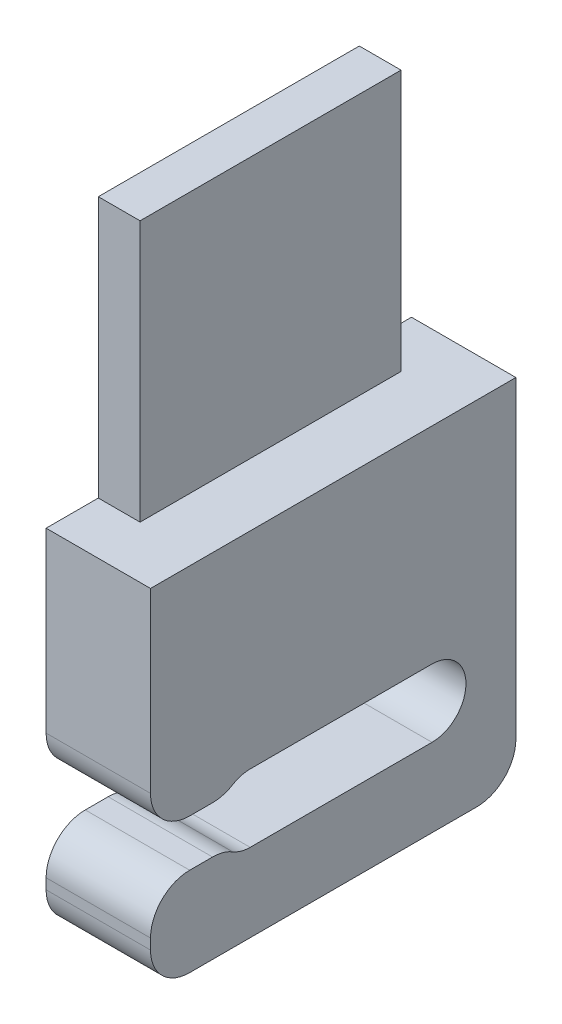
ISO-10303-21;
HEADER;
FILE_DESCRIPTION(('STEP AP214'),'2;1');
FILE_NAME('part.step','',(''),(''),'','','');
FILE_SCHEMA(('AUTOMOTIVE_DESIGN { 1 0 10303 214 1 1 1 1 }'));
ENDSEC;
DATA;
#1=APPLICATION_CONTEXT('core data for automotive mechanical design processes');
#2=APPLICATION_PROTOCOL_DEFINITION('international standard','automotive_design',2000,#1);
#3=PRODUCT_CONTEXT('',#1,'mechanical');
#4=PRODUCT('Part','Part','',(#3));
#5=PRODUCT_RELATED_PRODUCT_CATEGORY('part','',(#4));
#6=PRODUCT_DEFINITION_FORMATION('','',#4);
#7=PRODUCT_DEFINITION_CONTEXT('part definition',#1,'design');
#8=PRODUCT_DEFINITION('design','',#6,#7);
#9=PRODUCT_DEFINITION_SHAPE('','',#8);
#10=(LENGTH_UNIT() NAMED_UNIT(*) SI_UNIT(.MILLI.,.METRE.));
#11=(NAMED_UNIT(*) PLANE_ANGLE_UNIT() SI_UNIT($,.RADIAN.));
#12=(NAMED_UNIT(*) SI_UNIT($,.STERADIAN.) SOLID_ANGLE_UNIT());
#13=UNCERTAINTY_MEASURE_WITH_UNIT(LENGTH_MEASURE(1.E-05),#10,'distance_accuracy_value','');
#14=(GEOMETRIC_REPRESENTATION_CONTEXT(3) GLOBAL_UNCERTAINTY_ASSIGNED_CONTEXT((#13)) GLOBAL_UNIT_ASSIGNED_CONTEXT((#10,
#11,#12)) REPRESENTATION_CONTEXT('',''));
#15=CARTESIAN_POINT('',(0.,0.,0.));
#16=DIRECTION('',(0.,0.,1.));
#17=DIRECTION('',(1.,0.,0.));
#18=AXIS2_PLACEMENT_3D('',#15,#16,#17);
#19=CARTESIAN_POINT('',(1.6,0.,-10.));
#20=DIRECTION('',(0.,0.,1.));
#21=DIRECTION('',(0.,-1.,0.));
#22=AXIS2_PLACEMENT_3D('',#19,#20,#21);
#23=PLANE('',#22);
#24=DIRECTION('',(1.,0.,0.));
#25=VECTOR('',#24,1.);
#26=CARTESIAN_POINT('',(4.,-10.,-10.));
#27=LINE('',#26,#25);
#28=CARTESIAN_POINT('',(0.,-10.,-10.));
#29=VERTEX_POINT('',#28);
#30=CARTESIAN_POINT('',(1.6,-10.,-10.));
#31=VERTEX_POINT('',#30);
#32=EDGE_CURVE('E258',#29,#31,#27,.T.);
#33=ORIENTED_EDGE('',*,*,#32,.F.);
#34=DIRECTION('',(0.,1.,0.));
#35=VECTOR('',#34,1.);
#36=CARTESIAN_POINT('',(0.,0.,-10.));
#37=LINE('',#36,#35);
#38=CARTESIAN_POINT('',(0.,0.,-10.));
#39=VERTEX_POINT('',#38);
#40=EDGE_CURVE('E300',#29,#39,#37,.T.);
#41=ORIENTED_EDGE('',*,*,#40,.T.);
#42=DIRECTION('',(-1.,0.,0.));
#43=VECTOR('',#42,1.);
#44=CARTESIAN_POINT('',(1.6,0.,-10.));
#45=LINE('',#44,#43);
#46=CARTESIAN_POINT('',(1.6,0.,-10.));
#47=VERTEX_POINT('',#46);
#48=EDGE_CURVE('E280',#47,#39,#45,.T.);
#49=ORIENTED_EDGE('',*,*,#48,.F.);
#50=DIRECTION('',(0.,1.,0.));
#51=VECTOR('',#50,1.);
#52=CARTESIAN_POINT('',(1.6,0.,-10.));
#53=LINE('',#52,#51);
#54=EDGE_CURVE('E294',#31,#47,#53,.T.);
#55=ORIENTED_EDGE('',*,*,#54,.F.);
#56=EDGE_LOOP('',(#33,#41,#49,#55));
#57=FACE_BOUND('',#56,.T.);
#58=ADVANCED_FACE('F39',(#57),#23,.F.);
#59=CARTESIAN_POINT('',(1.6,0.,0.));
#60=DIRECTION('',(0.,0.,-1.));
#61=DIRECTION('',(-1.,0.,0.));
#62=AXIS2_PLACEMENT_3D('',#59,#60,#61);
#63=PLANE('',#62);
#64=DIRECTION('',(-1.,0.,0.));
#65=VECTOR('',#64,1.);
#66=CARTESIAN_POINT('',(4.,-10.,0.));
#67=LINE('',#66,#65);
#68=CARTESIAN_POINT('',(1.6,-10.,0.));
#69=VERTEX_POINT('',#68);
#70=CARTESIAN_POINT('',(0.,-10.,0.));
#71=VERTEX_POINT('',#70);
#72=EDGE_CURVE('E276',#69,#71,#67,.T.);
#73=ORIENTED_EDGE('',*,*,#72,.F.);
#74=DIRECTION('',(0.,-1.,0.));
#75=VECTOR('',#74,1.);
#76=CARTESIAN_POINT('',(1.6,0.,0.));
#77=LINE('',#76,#75);
#78=CARTESIAN_POINT('',(1.6,0.,0.));
#79=VERTEX_POINT('',#78);
#80=EDGE_CURVE('E287',#79,#69,#77,.T.);
#81=ORIENTED_EDGE('',*,*,#80,.F.);
#82=DIRECTION('',(-1.,0.,0.));
#83=VECTOR('',#82,1.);
#84=CARTESIAN_POINT('',(1.6,0.,0.));
#85=LINE('',#84,#83);
#86=CARTESIAN_POINT('',(0.,0.,0.));
#87=VERTEX_POINT('',#86);
#88=EDGE_CURVE('E298',#79,#87,#85,.T.);
#89=ORIENTED_EDGE('',*,*,#88,.T.);
#90=DIRECTION('',(0.,-1.,0.));
#91=VECTOR('',#90,1.);
#92=CARTESIAN_POINT('',(0.,0.,0.));
#93=LINE('',#92,#91);
#94=EDGE_CURVE('E286',#87,#71,#93,.T.);
#95=ORIENTED_EDGE('',*,*,#94,.T.);
#96=EDGE_LOOP('',(#73,#81,#89,#95));
#97=FACE_BOUND('',#96,.T.);
#98=ADVANCED_FACE('F366',(#97),#63,.F.);
#99=CARTESIAN_POINT('',(1.6,0.,0.));
#100=DIRECTION('',(0.,-1.,0.));
#101=DIRECTION('',(0.,0.,-1.));
#102=AXIS2_PLACEMENT_3D('',#99,#100,#101);
#103=PLANE('',#102);
#104=DIRECTION('',(0.,0.,1.));
#105=VECTOR('',#104,1.);
#106=CARTESIAN_POINT('',(0.,0.,0.));
#107=LINE('',#106,#105);
#108=EDGE_CURVE('E291',#39,#87,#107,.T.);
#109=ORIENTED_EDGE('',*,*,#108,.T.);
#110=ORIENTED_EDGE('',*,*,#88,.F.);
#111=DIRECTION('',(0.,0.,1.));
#112=VECTOR('',#111,1.);
#113=CARTESIAN_POINT('',(1.6,0.,0.));
#114=LINE('',#113,#112);
#115=EDGE_CURVE('E296',#47,#79,#114,.T.);
#116=ORIENTED_EDGE('',*,*,#115,.F.);
#117=ORIENTED_EDGE('',*,*,#48,.T.);
#118=EDGE_LOOP('',(#109,#110,#116,#117));
#119=FACE_BOUND('',#118,.T.);
#120=ADVANCED_FACE('F370',(#119),#103,.F.);
#121=CARTESIAN_POINT('',(1.6,0.,0.));
#122=DIRECTION('',(1.,0.,0.));
#123=DIRECTION('',(0.,0.,-1.));
#124=AXIS2_PLACEMENT_3D('',#121,#122,#123);
#125=PLANE('',#124);
#126=ORIENTED_EDGE('',*,*,#80,.T.);
#127=DIRECTION('',(0.,0.,-1.));
#128=VECTOR('',#127,1.);
#129=CARTESIAN_POINT('',(1.6,-10.,0.));
#130=LINE('',#129,#128);
#131=EDGE_CURVE('E290',#69,#31,#130,.T.);
#132=ORIENTED_EDGE('',*,*,#131,.T.);
#133=ORIENTED_EDGE('',*,*,#54,.T.);
#134=ORIENTED_EDGE('',*,*,#115,.T.);
#135=EDGE_LOOP('',(#126,#132,#133,#134));
#136=FACE_BOUND('',#135,.T.);
#137=ADVANCED_FACE('F379',(#136),#125,.T.);
#138=CARTESIAN_POINT('',(0.,0.,0.));
#139=DIRECTION('',(1.,0.,0.));
#140=DIRECTION('',(0.,0.,-1.));
#141=AXIS2_PLACEMENT_3D('',#138,#139,#140);
#142=PLANE('',#141);
#143=DIRECTION('',(0.,1.,0.));
#144=VECTOR('',#143,1.);
#145=CARTESIAN_POINT('',(0.,0.,2.));
#146=LINE('',#145,#144);
#147=CARTESIAN_POINT('',(0.,-22.,2.));
#148=VERTEX_POINT('',#147);
#149=CARTESIAN_POINT('',(0.,-21.6,2.));
#150=VERTEX_POINT('',#149);
#151=EDGE_CURVE('E206',#148,#150,#146,.T.);
#152=ORIENTED_EDGE('',*,*,#151,.T.);
#153=CARTESIAN_POINT('',(0.,-21.6,0.499999999999999));
#154=DIRECTION('',(1.,0.,0.));
#155=DIRECTION('',(0.,0.,-1.));
#156=AXIS2_PLACEMENT_3D('',#153,#154,#155);
#157=CIRCLE('',#156,1.5);
#158=CARTESIAN_POINT('',(0.,-20.1,0.499999999999999));
#159=VERTEX_POINT('',#158);
#160=EDGE_CURVE('E324',#150,#159,#157,.F.);
#161=ORIENTED_EDGE('',*,*,#160,.T.);
#162=DIRECTION('',(0.,0.,-1.));
#163=VECTOR('',#162,1.);
#164=CARTESIAN_POINT('',(0.,-20.1,0.));
#165=LINE('',#164,#163);
#166=CARTESIAN_POINT('',(0.,-20.1,-0.376528683431878));
#167=VERTEX_POINT('',#166);
#168=EDGE_CURVE('E660',#159,#167,#165,.T.);
#169=ORIENTED_EDGE('',*,*,#168,.T.);
#170=CARTESIAN_POINT('',(0.,-21.6,-0.376528683431878));
#171=DIRECTION('',(1.,0.,0.));
#172=DIRECTION('',(0.,0.,-1.));
#173=AXIS2_PLACEMENT_3D('',#170,#171,#172);
#174=CIRCLE('',#173,1.5);
#175=CARTESIAN_POINT('',(0.,-20.3142857142857,-1.14914681388844));
#176=VERTEX_POINT('',#175);
#177=EDGE_CURVE('E322',#167,#176,#174,.F.);
#178=ORIENTED_EDGE('',*,*,#177,.T.);
#179=CARTESIAN_POINT('',(0.,-19.2,-1.81874919361747));
#180=DIRECTION('',(1.,0.,0.));
#181=DIRECTION('',(0.,0.,-1.));
#182=AXIS2_PLACEMENT_3D('',#179,#180,#181);
#183=CIRCLE('',#182,1.3);
#184=CARTESIAN_POINT('',(0.,-20.5,-1.81874919361747));
#185=VERTEX_POINT('',#184);
#186=EDGE_CURVE('E657',#185,#176,#183,.F.);
#187=ORIENTED_EDGE('',*,*,#186,.F.);
#188=DIRECTION('',(0.,0.,-1.));
#189=VECTOR('',#188,1.);
#190=CARTESIAN_POINT('',(0.,-20.5,0.));
#191=LINE('',#190,#189);
#192=CARTESIAN_POINT('',(0.,-20.5,-8.78711207779404));
#193=VERTEX_POINT('',#192);
#194=EDGE_CURVE('E655',#185,#193,#191,.T.);
#195=ORIENTED_EDGE('',*,*,#194,.T.);
#196=CARTESIAN_POINT('',(0.,-19.2,-8.78711207779404));
#197=DIRECTION('',(1.,0.,0.));
#198=DIRECTION('',(0.,0.,-1.));
#199=AXIS2_PLACEMENT_3D('',#196,#197,#198);
#200=CIRCLE('',#199,1.3);
#201=CARTESIAN_POINT('',(0.,-17.9,-8.78711207779404));
#202=VERTEX_POINT('',#201);
#203=EDGE_CURVE('E652',#202,#193,#200,.F.);
#204=ORIENTED_EDGE('',*,*,#203,.F.);
#205=DIRECTION('',(0.,0.,-1.));
#206=VECTOR('',#205,1.);
#207=CARTESIAN_POINT('',(0.,-17.9,0.));
#208=LINE('',#207,#206);
#209=CARTESIAN_POINT('',(0.,-17.9,-1.81874919361747));
#210=VERTEX_POINT('',#209);
#211=EDGE_CURVE('E342',#210,#202,#208,.T.);
#212=ORIENTED_EDGE('',*,*,#211,.F.);
#213=CARTESIAN_POINT('',(0.,-19.2,-1.81874919361747));
#214=DIRECTION('',(1.,0.,0.));
#215=DIRECTION('',(0.,0.,-1.));
#216=AXIS2_PLACEMENT_3D('',#213,#214,#215);
#217=CIRCLE('',#216,1.3);
#218=CARTESIAN_POINT('',(0.,-18.0857142857143,-1.14914681388844));
#219=VERTEX_POINT('',#218);
#220=EDGE_CURVE('E336',#219,#210,#217,.F.);
#221=ORIENTED_EDGE('',*,*,#220,.F.);
#222=CARTESIAN_POINT('',(0.,-16.8,-0.376528683431878));
#223=DIRECTION('',(1.,0.,0.));
#224=DIRECTION('',(0.,0.,-1.));
#225=AXIS2_PLACEMENT_3D('',#222,#223,#224);
#226=CIRCLE('',#225,1.5);
#227=CARTESIAN_POINT('',(0.,-18.3,-0.376528683431878));
#228=VERTEX_POINT('',#227);
#229=EDGE_CURVE('E60',#219,#228,#226,.F.);
#230=ORIENTED_EDGE('',*,*,#229,.T.);
#231=DIRECTION('',(0.,0.,-1.));
#232=VECTOR('',#231,1.);
#233=CARTESIAN_POINT('',(0.,-18.3,0.));
#234=LINE('',#233,#232);
#235=CARTESIAN_POINT('',(0.,-18.3,0.5));
#236=VERTEX_POINT('',#235);
#237=EDGE_CURVE('E344',#236,#228,#234,.T.);
#238=ORIENTED_EDGE('',*,*,#237,.F.);
#239=CARTESIAN_POINT('',(0.,-16.8,0.5));
#240=DIRECTION('',(1.,0.,0.));
#241=DIRECTION('',(0.,0.,-1.));
#242=AXIS2_PLACEMENT_3D('',#239,#240,#241);
#243=CIRCLE('',#242,1.5);
#244=CARTESIAN_POINT('',(0.,-16.8,2.));
#245=VERTEX_POINT('',#244);
#246=EDGE_CURVE('E54',#236,#245,#243,.F.);
#247=ORIENTED_EDGE('',*,*,#246,.T.);
#248=DIRECTION('',(0.,-1.,0.));
#249=VECTOR('',#248,1.);
#250=CARTESIAN_POINT('',(0.,-10.,2.));
#251=LINE('',#250,#249);
#252=CARTESIAN_POINT('',(0.,-10.,2.));
#253=VERTEX_POINT('',#252);
#254=EDGE_CURVE('E273',#253,#245,#251,.T.);
#255=ORIENTED_EDGE('',*,*,#254,.F.);
#256=DIRECTION('',(0.,0.,-1.));
#257=VECTOR('',#256,1.);
#258=CARTESIAN_POINT('',(0.,-10.,2.));
#259=LINE('',#258,#257);
#260=EDGE_CURVE('E275',#253,#71,#259,.T.);
#261=ORIENTED_EDGE('',*,*,#260,.T.);
#262=ORIENTED_EDGE('',*,*,#94,.F.);
#263=ORIENTED_EDGE('',*,*,#108,.F.);
#264=ORIENTED_EDGE('',*,*,#40,.F.);
#265=DIRECTION('',(0.,0.,1.));
#266=VECTOR('',#265,1.);
#267=CARTESIAN_POINT('',(0.,-10.,-12.));
#268=LINE('',#267,#266);
#269=CARTESIAN_POINT('',(0.,-10.,-12.));
#270=VERTEX_POINT('',#269);
#271=EDGE_CURVE('E266',#270,#29,#268,.T.);
#272=ORIENTED_EDGE('',*,*,#271,.F.);
#273=DIRECTION('',(0.,1.,0.));
#274=VECTOR('',#273,1.);
#275=CARTESIAN_POINT('',(0.,-10.,-12.));
#276=LINE('',#275,#274);
#277=CARTESIAN_POINT('',(0.,-22.,-12.));
#278=VERTEX_POINT('',#277);
#279=EDGE_CURVE('E261',#278,#270,#276,.T.);
#280=ORIENTED_EDGE('',*,*,#279,.F.);
#281=CARTESIAN_POINT('',(0.,-22.,-10.5));
#282=DIRECTION('',(1.,0.,0.));
#283=DIRECTION('',(0.,0.,-1.));
#284=AXIS2_PLACEMENT_3D('',#281,#282,#283);
#285=CIRCLE('',#284,1.5);
#286=CARTESIAN_POINT('',(0.,-23.5,-10.5));
#287=VERTEX_POINT('',#286);
#288=EDGE_CURVE('E645',#278,#287,#285,.F.);
#289=ORIENTED_EDGE('',*,*,#288,.T.);
#290=DIRECTION('',(0.,0.,1.));
#291=VECTOR('',#290,1.);
#292=CARTESIAN_POINT('',(0.,-23.5,0.));
#293=LINE('',#292,#291);
#294=CARTESIAN_POINT('',(0.,-23.5,0.499999999999999));
#295=VERTEX_POINT('',#294);
#296=EDGE_CURVE('E243',#287,#295,#293,.T.);
#297=ORIENTED_EDGE('',*,*,#296,.T.);
#298=CARTESIAN_POINT('',(0.,-22.,0.499999999999999));
#299=DIRECTION('',(1.,0.,0.));
#300=DIRECTION('',(0.,0.,-1.));
#301=AXIS2_PLACEMENT_3D('',#298,#299,#300);
#302=CIRCLE('',#301,1.5);
#303=EDGE_CURVE('E256',#295,#148,#302,.F.);
#304=ORIENTED_EDGE('',*,*,#303,.T.);
#305=EDGE_LOOP('',(#152,#161,#169,#178,#187,#195,#204,#212,#221,#230,#238,#247,#255,#261,#262,
#263,#264,#272,#280,#289,#297,#304));
#306=FACE_BOUND('',#305,.T.);
#307=ADVANCED_FACE('F340',(#306),#142,.F.);
#308=CARTESIAN_POINT('',(4.,0.,-14.4721359549996));
#309=DIRECTION('',(-1.,0.,0.));
#310=DIRECTION('',(0.,-1.,0.));
#311=AXIS2_PLACEMENT_3D('',#308,#309,#310);
#312=PLANE('',#311);
#313=DIRECTION('',(0.,0.,1.));
#314=VECTOR('',#313,1.);
#315=CARTESIAN_POINT('',(4.,-20.1,0.));
#316=LINE('',#315,#314);
#317=CARTESIAN_POINT('',(4.,-20.1,-0.376528683431878));
#318=VERTEX_POINT('',#317);
#319=CARTESIAN_POINT('',(4.,-20.1,0.499999999999999));
#320=VERTEX_POINT('',#319);
#321=EDGE_CURVE('E210',#318,#320,#316,.T.);
#322=ORIENTED_EDGE('',*,*,#321,.T.);
#323=CARTESIAN_POINT('',(3.99999999999999,-21.6,0.499999999999999));
#324=DIRECTION('',(-1.,0.,0.));
#325=DIRECTION('',(0.,-1.,0.));
#326=AXIS2_PLACEMENT_3D('',#323,#324,#325);
#327=CIRCLE('',#326,1.5);
#328=CARTESIAN_POINT('',(4.,-21.6,2.));
#329=VERTEX_POINT('',#328);
#330=EDGE_CURVE('E197',#320,#329,#327,.F.);
#331=ORIENTED_EDGE('',*,*,#330,.T.);
#332=DIRECTION('',(0.,-1.,0.));
#333=VECTOR('',#332,1.);
#334=CARTESIAN_POINT('',(4.00000000000001,0.,2.));
#335=LINE('',#334,#333);
#336=CARTESIAN_POINT('',(3.99999999999999,-22.,2.));
#337=VERTEX_POINT('',#336);
#338=EDGE_CURVE('E190',#329,#337,#335,.T.);
#339=ORIENTED_EDGE('',*,*,#338,.T.);
#340=CARTESIAN_POINT('',(3.99999999999999,-22.,0.499999999999999));
#341=DIRECTION('',(1.,0.,0.));
#342=DIRECTION('',(0.,1.,0.));
#343=AXIS2_PLACEMENT_3D('',#340,#341,#342);
#344=CIRCLE('',#343,1.5);
#345=CARTESIAN_POINT('',(3.99999999999999,-23.5,0.499999999999999));
#346=VERTEX_POINT('',#345);
#347=EDGE_CURVE('E196',#337,#346,#344,.T.);
#348=ORIENTED_EDGE('',*,*,#347,.T.);
#349=DIRECTION('',(0.,0.,-1.));
#350=VECTOR('',#349,1.);
#351=CARTESIAN_POINT('',(3.99999999999999,-23.5,0.));
#352=LINE('',#351,#350);
#353=CARTESIAN_POINT('',(3.99999999999999,-23.5,-10.5));
#354=VERTEX_POINT('',#353);
#355=EDGE_CURVE('E215',#346,#354,#352,.T.);
#356=ORIENTED_EDGE('',*,*,#355,.T.);
#357=CARTESIAN_POINT('',(3.99999999999999,-22.,-10.5));
#358=DIRECTION('',(1.,0.,0.));
#359=DIRECTION('',(0.,1.,0.));
#360=AXIS2_PLACEMENT_3D('',#357,#358,#359);
#361=CIRCLE('',#360,1.5);
#362=CARTESIAN_POINT('',(3.99999999999999,-22.,-12.));
#363=VERTEX_POINT('',#362);
#364=EDGE_CURVE('E217',#354,#363,#361,.T.);
#365=ORIENTED_EDGE('',*,*,#364,.T.);
#366=DIRECTION('',(0.,-1.,0.));
#367=VECTOR('',#366,1.);
#368=CARTESIAN_POINT('',(4.,-10.,-12.));
#369=LINE('',#368,#367);
#370=CARTESIAN_POINT('',(4.,-10.,-12.));
#371=VERTEX_POINT('',#370);
#372=EDGE_CURVE('E259',#371,#363,#369,.T.);
#373=ORIENTED_EDGE('',*,*,#372,.F.);
#374=DIRECTION('',(0.,0.,1.));
#375=VECTOR('',#374,1.);
#376=CARTESIAN_POINT('',(4.,-10.,-14.4721359549996));
#377=LINE('',#376,#375);
#378=CARTESIAN_POINT('',(4.,-10.,2.));
#379=VERTEX_POINT('',#378);
#380=EDGE_CURVE('E283',#371,#379,#377,.T.);
#381=ORIENTED_EDGE('',*,*,#380,.T.);
#382=DIRECTION('',(0.,1.,0.));
#383=VECTOR('',#382,1.);
#384=CARTESIAN_POINT('',(4.,-10.,2.));
#385=LINE('',#384,#383);
#386=CARTESIAN_POINT('',(4.,-16.8,2.));
#387=VERTEX_POINT('',#386);
#388=EDGE_CURVE('E269',#387,#379,#385,.T.);
#389=ORIENTED_EDGE('',*,*,#388,.F.);
#390=CARTESIAN_POINT('',(4.,-16.8,0.5));
#391=DIRECTION('',(-1.,0.,0.));
#392=DIRECTION('',(0.,-1.,0.));
#393=AXIS2_PLACEMENT_3D('',#390,#391,#392);
#394=CIRCLE('',#393,1.5);
#395=CARTESIAN_POINT('',(4.,-18.3,0.5));
#396=VERTEX_POINT('',#395);
#397=EDGE_CURVE('E311',#387,#396,#394,.F.);
#398=ORIENTED_EDGE('',*,*,#397,.T.);
#399=DIRECTION('',(0.,0.,1.));
#400=VECTOR('',#399,1.);
#401=CARTESIAN_POINT('',(4.,-18.3,0.));
#402=LINE('',#401,#400);
#403=CARTESIAN_POINT('',(4.,-18.3,-0.376528683431878));
#404=VERTEX_POINT('',#403);
#405=EDGE_CURVE('E223',#404,#396,#402,.T.);
#406=ORIENTED_EDGE('',*,*,#405,.F.);
#407=CARTESIAN_POINT('',(4.,-16.8,-0.376528683431878));
#408=DIRECTION('',(-1.,0.,0.));
#409=DIRECTION('',(0.,-1.,0.));
#410=AXIS2_PLACEMENT_3D('',#407,#408,#409);
#411=CIRCLE('',#410,1.5);
#412=CARTESIAN_POINT('',(4.,-18.0857142857143,-1.14914681388844));
#413=VERTEX_POINT('',#412);
#414=EDGE_CURVE('E313',#404,#413,#411,.F.);
#415=ORIENTED_EDGE('',*,*,#414,.T.);
#416=CARTESIAN_POINT('',(4.,-19.2,-1.81874919361747));
#417=DIRECTION('',(1.,0.,0.));
#418=DIRECTION('',(0.,1.,0.));
#419=AXIS2_PLACEMENT_3D('',#416,#417,#418);
#420=CIRCLE('',#419,1.3);
#421=CARTESIAN_POINT('',(4.,-17.9,-1.81874919361747));
#422=VERTEX_POINT('',#421);
#423=EDGE_CURVE('E226',#422,#413,#420,.T.);
#424=ORIENTED_EDGE('',*,*,#423,.F.);
#425=DIRECTION('',(0.,0.,1.));
#426=VECTOR('',#425,1.);
#427=CARTESIAN_POINT('',(4.,-17.9,0.));
#428=LINE('',#427,#426);
#429=CARTESIAN_POINT('',(4.,-17.9,-8.78711207779404));
#430=VERTEX_POINT('',#429);
#431=EDGE_CURVE('E229',#430,#422,#428,.T.);
#432=ORIENTED_EDGE('',*,*,#431,.F.);
#433=CARTESIAN_POINT('',(4.,-19.2,-8.78711207779404));
#434=DIRECTION('',(1.,0.,0.));
#435=DIRECTION('',(0.,1.,0.));
#436=AXIS2_PLACEMENT_3D('',#433,#434,#435);
#437=CIRCLE('',#436,1.3);
#438=CARTESIAN_POINT('',(4.,-20.5,-8.78711207779404));
#439=VERTEX_POINT('',#438);
#440=EDGE_CURVE('E233',#439,#430,#437,.T.);
#441=ORIENTED_EDGE('',*,*,#440,.F.);
#442=DIRECTION('',(0.,0.,1.));
#443=VECTOR('',#442,1.);
#444=CARTESIAN_POINT('',(4.,-20.5,0.));
#445=LINE('',#444,#443);
#446=CARTESIAN_POINT('',(4.,-20.5,-1.81874919361747));
#447=VERTEX_POINT('',#446);
#448=EDGE_CURVE('E236',#439,#447,#445,.T.);
#449=ORIENTED_EDGE('',*,*,#448,.T.);
#450=CARTESIAN_POINT('',(4.,-20.3142857142857,-1.14914681388844));
#451=VERTEX_POINT('',#450);
#452=EDGE_CURVE('E230',#451,#447,#420,.T.);
#453=ORIENTED_EDGE('',*,*,#452,.F.);
#454=CARTESIAN_POINT('',(3.99999999999999,-21.6,-0.376528683431878));
#455=DIRECTION('',(-1.,0.,0.));
#456=DIRECTION('',(0.,-1.,0.));
#457=AXIS2_PLACEMENT_3D('',#454,#455,#456);
#458=CIRCLE('',#457,1.5);
#459=EDGE_CURVE('E315',#451,#318,#458,.F.);
#460=ORIENTED_EDGE('',*,*,#459,.T.);
#461=EDGE_LOOP('',(#322,#331,#339,#348,#356,#365,#373,#381,#389,#398,#406,#415,#424,#432,#441,
#449,#453,#460));
#462=FACE_BOUND('',#461,.T.);
#463=ADVANCED_FACE('F193',(#462),#312,.F.);
#464=CARTESIAN_POINT('',(0.,-10.,-14.4721359549996));
#465=DIRECTION('',(0.,-1.,0.));
#466=DIRECTION('',(0.,0.,-1.));
#467=AXIS2_PLACEMENT_3D('',#464,#465,#466);
#468=PLANE('',#467);
#469=ORIENTED_EDGE('',*,*,#131,.F.);
#470=ORIENTED_EDGE('',*,*,#72,.T.);
#471=ORIENTED_EDGE('',*,*,#260,.F.);
#472=DIRECTION('',(-1.,0.,0.));
#473=VECTOR('',#472,1.);
#474=CARTESIAN_POINT('',(4.,-10.,2.));
#475=LINE('',#474,#473);
#476=EDGE_CURVE('E271',#379,#253,#475,.T.);
#477=ORIENTED_EDGE('',*,*,#476,.F.);
#478=ORIENTED_EDGE('',*,*,#380,.F.);
#479=DIRECTION('',(1.,0.,0.));
#480=VECTOR('',#479,1.);
#481=CARTESIAN_POINT('',(4.,-10.,-12.));
#482=LINE('',#481,#480);
#483=EDGE_CURVE('E263',#270,#371,#482,.T.);
#484=ORIENTED_EDGE('',*,*,#483,.F.);
#485=ORIENTED_EDGE('',*,*,#271,.T.);
#486=ORIENTED_EDGE('',*,*,#32,.T.);
#487=EDGE_LOOP('',(#469,#470,#471,#477,#478,#484,#485,#486));
#488=FACE_BOUND('',#487,.T.);
#489=ADVANCED_FACE('F363',(#488),#468,.F.);
#490=CARTESIAN_POINT('',(0.,0.,2.));
#491=DIRECTION('',(0.,0.,-1.));
#492=DIRECTION('',(-1.,0.,0.));
#493=AXIS2_PLACEMENT_3D('',#490,#491,#492);
#494=PLANE('',#493);
#495=ORIENTED_EDGE('',*,*,#254,.T.);
#496=DIRECTION('',(1.,0.,0.));
#497=VECTOR('',#496,1.);
#498=CARTESIAN_POINT('',(0.,-16.8,2.));
#499=LINE('',#498,#497);
#500=EDGE_CURVE('E11',#245,#387,#499,.T.);
#501=ORIENTED_EDGE('',*,*,#500,.T.);
#502=ORIENTED_EDGE('',*,*,#388,.T.);
#503=ORIENTED_EDGE('',*,*,#476,.T.);
#504=EDGE_LOOP('',(#495,#501,#502,#503));
#505=FACE_BOUND('',#504,.T.);
#506=ADVANCED_FACE('F356',(#505),#494,.F.);
#507=CARTESIAN_POINT('',(0.,0.,-12.));
#508=DIRECTION('',(0.,0.,-1.));
#509=DIRECTION('',(-1.,0.,0.));
#510=AXIS2_PLACEMENT_3D('',#507,#508,#509);
#511=PLANE('',#510);
#512=ORIENTED_EDGE('',*,*,#372,.T.);
#513=DIRECTION('',(1.,0.,0.));
#514=VECTOR('',#513,1.);
#515=CARTESIAN_POINT('',(-18.1176709319934,-22.,-12.));
#516=LINE('',#515,#514);
#517=EDGE_CURVE('E250',#278,#363,#516,.T.);
#518=ORIENTED_EDGE('',*,*,#517,.F.);
#519=ORIENTED_EDGE('',*,*,#279,.T.);
#520=ORIENTED_EDGE('',*,*,#483,.T.);
#521=EDGE_LOOP('',(#512,#518,#519,#520));
#522=FACE_BOUND('',#521,.T.);
#523=ADVANCED_FACE('F480',(#522),#511,.T.);
#524=CARTESIAN_POINT('',(-18.1176709319934,0.,2.));
#525=DIRECTION('',(0.,0.,1.));
#526=DIRECTION('',(0.,-1.,0.));
#527=AXIS2_PLACEMENT_3D('',#524,#525,#526);
#528=PLANE('',#527);
#529=ORIENTED_EDGE('',*,*,#338,.F.);
#530=DIRECTION('',(1.,0.,0.));
#531=VECTOR('',#530,1.);
#532=CARTESIAN_POINT('',(-18.1176709319934,-21.6,2.));
#533=LINE('',#532,#531);
#534=EDGE_CURVE('E318',#329,#150,#533,.F.);
#535=ORIENTED_EDGE('',*,*,#534,.T.);
#536=ORIENTED_EDGE('',*,*,#151,.F.);
#537=DIRECTION('',(1.,0.,0.));
#538=VECTOR('',#537,1.);
#539=CARTESIAN_POINT('',(-18.1176709319934,-22.,2.));
#540=LINE('',#539,#538);
#541=EDGE_CURVE('E203',#148,#337,#540,.T.);
#542=ORIENTED_EDGE('',*,*,#541,.T.);
#543=EDGE_LOOP('',(#529,#535,#536,#542));
#544=FACE_BOUND('',#543,.T.);
#545=ADVANCED_FACE('F204',(#544),#528,.T.);
#546=CARTESIAN_POINT('',(-18.1176709319934,-20.1,0.));
#547=DIRECTION('',(0.,1.,0.));
#548=DIRECTION('',(-1.,0.,0.));
#549=AXIS2_PLACEMENT_3D('',#546,#547,#548);
#550=PLANE('',#549);
#551=ORIENTED_EDGE('',*,*,#168,.F.);
#552=DIRECTION('',(1.,0.,0.));
#553=VECTOR('',#552,1.);
#554=CARTESIAN_POINT('',(-18.1176709319934,-20.1,0.499999999999999));
#555=LINE('',#554,#553);
#556=EDGE_CURVE('E308',#159,#320,#555,.T.);
#557=ORIENTED_EDGE('',*,*,#556,.T.);
#558=ORIENTED_EDGE('',*,*,#321,.F.);
#559=DIRECTION('',(-1.,0.,0.));
#560=VECTOR('',#559,1.);
#561=CARTESIAN_POINT('',(0.,-20.1,-0.376528683431878));
#562=LINE('',#561,#560);
#563=EDGE_CURVE('E279',#318,#167,#562,.T.);
#564=ORIENTED_EDGE('',*,*,#563,.T.);
#565=EDGE_LOOP('',(#551,#557,#558,#564));
#566=FACE_BOUND('',#565,.T.);
#567=ADVANCED_FACE('F460',(#566),#550,.T.);
#568=CARTESIAN_POINT('',(-18.1176709319934,-19.2,-1.81874919361747));
#569=DIRECTION('',(1.,0.,0.));
#570=DIRECTION('',(0.,1.,0.));
#571=AXIS2_PLACEMENT_3D('',#568,#569,#570);
#572=CYLINDRICAL_SURFACE('',#571,1.3);
#573=ORIENTED_EDGE('',*,*,#186,.T.);
#574=DIRECTION('',(1.,0.,0.));
#575=VECTOR('',#574,1.);
#576=CARTESIAN_POINT('',(-18.1176709319934,-20.3142857142857,-1.14914681388844));
#577=LINE('',#576,#575);
#578=EDGE_CURVE('E326',#176,#451,#577,.T.);
#579=ORIENTED_EDGE('',*,*,#578,.T.);
#580=ORIENTED_EDGE('',*,*,#452,.T.);
#581=DIRECTION('',(1.,0.,0.));
#582=VECTOR('',#581,1.);
#583=CARTESIAN_POINT('',(-18.1176709319934,-20.5,-1.81874919361747));
#584=LINE('',#583,#582);
#585=EDGE_CURVE('E240',#185,#447,#584,.T.);
#586=ORIENTED_EDGE('',*,*,#585,.F.);
#587=EDGE_LOOP('',(#573,#579,#580,#586));
#588=FACE_BOUND('',#587,.T.);
#589=ADVANCED_FACE('F449',(#588),#572,.F.);
#590=CARTESIAN_POINT('',(-18.1176709319934,-20.5,0.));
#591=DIRECTION('',(0.,1.,0.));
#592=DIRECTION('',(-1.,0.,0.));
#593=AXIS2_PLACEMENT_3D('',#590,#591,#592);
#594=PLANE('',#593);
#595=ORIENTED_EDGE('',*,*,#194,.F.);
#596=ORIENTED_EDGE('',*,*,#585,.T.);
#597=ORIENTED_EDGE('',*,*,#448,.F.);
#598=DIRECTION('',(1.,0.,0.));
#599=VECTOR('',#598,1.);
#600=CARTESIAN_POINT('',(-18.1176709319934,-20.5,-8.78711207779404));
#601=LINE('',#600,#599);
#602=EDGE_CURVE('E244',#193,#439,#601,.T.);
#603=ORIENTED_EDGE('',*,*,#602,.F.);
#604=EDGE_LOOP('',(#595,#596,#597,#603));
#605=FACE_BOUND('',#604,.T.);
#606=ADVANCED_FACE('F459',(#605),#594,.T.);
#607=CARTESIAN_POINT('',(-18.1176709319934,-19.2,-8.78711207779404));
#608=DIRECTION('',(1.,0.,0.));
#609=DIRECTION('',(0.,1.,0.));
#610=AXIS2_PLACEMENT_3D('',#607,#608,#609);
#611=CYLINDRICAL_SURFACE('',#610,1.3);
#612=DIRECTION('',(1.,0.,0.));
#613=VECTOR('',#612,1.);
#614=CARTESIAN_POINT('',(-18.1176709319934,-17.9,-8.78711207779404));
#615=LINE('',#614,#613);
#616=EDGE_CURVE('E246',#202,#430,#615,.T.);
#617=ORIENTED_EDGE('',*,*,#616,.F.);
#618=ORIENTED_EDGE('',*,*,#203,.T.);
#619=ORIENTED_EDGE('',*,*,#602,.T.);
#620=ORIENTED_EDGE('',*,*,#440,.T.);
#621=EDGE_LOOP('',(#617,#618,#619,#620));
#622=FACE_BOUND('',#621,.T.);
#623=ADVANCED_FACE('F539',(#622),#611,.F.);
#624=CARTESIAN_POINT('',(-18.1176709319934,-17.9,0.));
#625=DIRECTION('',(0.,1.,0.));
#626=DIRECTION('',(0.,0.,1.));
#627=AXIS2_PLACEMENT_3D('',#624,#625,#626);
#628=PLANE('',#627);
#629=DIRECTION('',(1.,0.,0.));
#630=VECTOR('',#629,1.);
#631=CARTESIAN_POINT('',(-18.1176709319934,-17.9,-1.81874919361747));
#632=LINE('',#631,#630);
#633=EDGE_CURVE('E248',#210,#422,#632,.T.);
#634=ORIENTED_EDGE('',*,*,#633,.F.);
#635=ORIENTED_EDGE('',*,*,#211,.T.);
#636=ORIENTED_EDGE('',*,*,#616,.T.);
#637=ORIENTED_EDGE('',*,*,#431,.T.);
#638=EDGE_LOOP('',(#634,#635,#636,#637));
#639=FACE_BOUND('',#638,.T.);
#640=ADVANCED_FACE('F447',(#639),#628,.F.);
#641=ORIENTED_EDGE('',*,*,#423,.T.);
#642=DIRECTION('',(1.,0.,0.));
#643=VECTOR('',#642,1.);
#644=CARTESIAN_POINT('',(-18.1176709319934,-18.0857142857143,-1.14914681388844));
#645=LINE('',#644,#643);
#646=EDGE_CURVE('E47',#413,#219,#645,.F.);
#647=ORIENTED_EDGE('',*,*,#646,.T.);
#648=ORIENTED_EDGE('',*,*,#220,.T.);
#649=ORIENTED_EDGE('',*,*,#633,.T.);
#650=EDGE_LOOP('',(#641,#647,#648,#649));
#651=FACE_BOUND('',#650,.T.);
#652=ADVANCED_FACE('F335',(#651),#572,.F.);
#653=CARTESIAN_POINT('',(-18.1176709319934,-18.3,0.));
#654=DIRECTION('',(0.,1.,0.));
#655=DIRECTION('',(-1.,0.,0.));
#656=AXIS2_PLACEMENT_3D('',#653,#654,#655);
#657=PLANE('',#656);
#658=ORIENTED_EDGE('',*,*,#237,.T.);
#659=DIRECTION('',(1.,0.,0.));
#660=VECTOR('',#659,1.);
#661=CARTESIAN_POINT('',(-18.1176709319934,-18.3,-0.376528683431878));
#662=LINE('',#661,#660);
#663=EDGE_CURVE('E331',#228,#404,#662,.T.);
#664=ORIENTED_EDGE('',*,*,#663,.T.);
#665=ORIENTED_EDGE('',*,*,#405,.T.);
#666=DIRECTION('',(1.,0.,0.));
#667=VECTOR('',#666,1.);
#668=CARTESIAN_POINT('',(-18.1176709319934,-18.3,0.5));
#669=LINE('',#668,#667);
#670=EDGE_CURVE('E329',#396,#236,#669,.F.);
#671=ORIENTED_EDGE('',*,*,#670,.T.);
#672=EDGE_LOOP('',(#658,#664,#665,#671));
#673=FACE_BOUND('',#672,.T.);
#674=ADVANCED_FACE('F350',(#673),#657,.F.);
#675=CARTESIAN_POINT('',(-18.1176709319934,-22.,-10.5));
#676=DIRECTION('',(1.,0.,0.));
#677=DIRECTION('',(0.,1.,0.));
#678=AXIS2_PLACEMENT_3D('',#675,#676,#677);
#679=CYLINDRICAL_SURFACE('',#678,1.5);
#680=ORIENTED_EDGE('',*,*,#288,.F.);
#681=ORIENTED_EDGE('',*,*,#517,.T.);
#682=ORIENTED_EDGE('',*,*,#364,.F.);
#683=DIRECTION('',(1.,0.,0.));
#684=VECTOR('',#683,1.);
#685=CARTESIAN_POINT('',(-18.1176709319934,-23.5,-10.5));
#686=LINE('',#685,#684);
#687=EDGE_CURVE('E253',#287,#354,#686,.T.);
#688=ORIENTED_EDGE('',*,*,#687,.F.);
#689=EDGE_LOOP('',(#680,#681,#682,#688));
#690=FACE_BOUND('',#689,.T.);
#691=ADVANCED_FACE('F436',(#690),#679,.T.);
#692=CARTESIAN_POINT('',(-18.1176709319934,-23.5,0.));
#693=DIRECTION('',(0.,-1.,0.));
#694=DIRECTION('',(1.,0.,0.));
#695=AXIS2_PLACEMENT_3D('',#692,#693,#694);
#696=PLANE('',#695);
#697=ORIENTED_EDGE('',*,*,#296,.F.);
#698=ORIENTED_EDGE('',*,*,#687,.T.);
#699=ORIENTED_EDGE('',*,*,#355,.F.);
#700=DIRECTION('',(1.,0.,0.));
#701=VECTOR('',#700,1.);
#702=CARTESIAN_POINT('',(-18.1176709319934,-23.5,0.499999999999999));
#703=LINE('',#702,#701);
#704=EDGE_CURVE('E209',#295,#346,#703,.T.);
#705=ORIENTED_EDGE('',*,*,#704,.F.);
#706=EDGE_LOOP('',(#697,#698,#699,#705));
#707=FACE_BOUND('',#706,.T.);
#708=ADVANCED_FACE('F516',(#707),#696,.T.);
#709=CARTESIAN_POINT('',(-18.1176709319934,-22.,0.499999999999999));
#710=DIRECTION('',(1.,0.,0.));
#711=DIRECTION('',(0.,1.,0.));
#712=AXIS2_PLACEMENT_3D('',#709,#710,#711);
#713=CYLINDRICAL_SURFACE('',#712,1.5);
#714=ORIENTED_EDGE('',*,*,#303,.F.);
#715=ORIENTED_EDGE('',*,*,#704,.T.);
#716=ORIENTED_EDGE('',*,*,#347,.F.);
#717=ORIENTED_EDGE('',*,*,#541,.F.);
#718=EDGE_LOOP('',(#714,#715,#716,#717));
#719=FACE_BOUND('',#718,.T.);
#720=ADVANCED_FACE('F212',(#719),#713,.T.);
#721=CARTESIAN_POINT('',(-18.1176709319934,-21.6,0.499999999999999));
#722=DIRECTION('',(1.,0.,0.));
#723=DIRECTION('',(0.,1.,0.));
#724=AXIS2_PLACEMENT_3D('',#721,#722,#723);
#725=CYLINDRICAL_SURFACE('',#724,1.5);
#726=ORIENTED_EDGE('',*,*,#160,.F.);
#727=ORIENTED_EDGE('',*,*,#534,.F.);
#728=ORIENTED_EDGE('',*,*,#330,.F.);
#729=ORIENTED_EDGE('',*,*,#556,.F.);
#730=EDGE_LOOP('',(#726,#727,#728,#729));
#731=FACE_BOUND('',#730,.T.);
#732=ADVANCED_FACE('F396',(#731),#725,.T.);
#733=CARTESIAN_POINT('',(-18.1176709319934,-21.6,-0.376528683431878));
#734=DIRECTION('',(1.,0.,0.));
#735=DIRECTION('',(0.,1.,0.));
#736=AXIS2_PLACEMENT_3D('',#733,#734,#735);
#737=CYLINDRICAL_SURFACE('',#736,1.5);
#738=ORIENTED_EDGE('',*,*,#177,.F.);
#739=ORIENTED_EDGE('',*,*,#563,.F.);
#740=ORIENTED_EDGE('',*,*,#459,.F.);
#741=ORIENTED_EDGE('',*,*,#578,.F.);
#742=EDGE_LOOP('',(#738,#739,#740,#741));
#743=FACE_BOUND('',#742,.T.);
#744=ADVANCED_FACE('F399',(#743),#737,.T.);
#745=CARTESIAN_POINT('',(-18.1176709319934,-16.8,-0.376528683431878));
#746=DIRECTION('',(1.,0.,0.));
#747=DIRECTION('',(0.,1.,0.));
#748=AXIS2_PLACEMENT_3D('',#745,#746,#747);
#749=CYLINDRICAL_SURFACE('',#748,1.5);
#750=ORIENTED_EDGE('',*,*,#229,.F.);
#751=ORIENTED_EDGE('',*,*,#646,.F.);
#752=ORIENTED_EDGE('',*,*,#414,.F.);
#753=ORIENTED_EDGE('',*,*,#663,.F.);
#754=EDGE_LOOP('',(#750,#751,#752,#753));
#755=FACE_BOUND('',#754,.T.);
#756=ADVANCED_FACE('F347',(#755),#749,.T.);
#757=CARTESIAN_POINT('',(0.,-16.8,0.5));
#758=DIRECTION('',(1.,0.,0.));
#759=DIRECTION('',(0.,1.,0.));
#760=AXIS2_PLACEMENT_3D('',#757,#758,#759);
#761=CYLINDRICAL_SURFACE('',#760,1.5);
#762=ORIENTED_EDGE('',*,*,#246,.F.);
#763=ORIENTED_EDGE('',*,*,#670,.F.);
#764=ORIENTED_EDGE('',*,*,#397,.F.);
#765=ORIENTED_EDGE('',*,*,#500,.F.);
#766=EDGE_LOOP('',(#762,#763,#764,#765));
#767=FACE_BOUND('',#766,.T.);
#768=ADVANCED_FACE('F41',(#767),#761,.T.);
#769=CLOSED_SHELL('',(#58,#98,#120,#137,#307,#463,#489,#506,#523,#545,#567,#589,#606,#623,#640,
#652,#674,#691,#708,#720,#732,#744,#756,#768));
#770=MANIFOLD_SOLID_BREP('B2',#769);
#771=ADVANCED_BREP_SHAPE_REPRESENTATION('',(#18,#770),#14);
#772=SHAPE_DEFINITION_REPRESENTATION(#9,#771);
ENDSEC;
END-ISO-10303-21;
